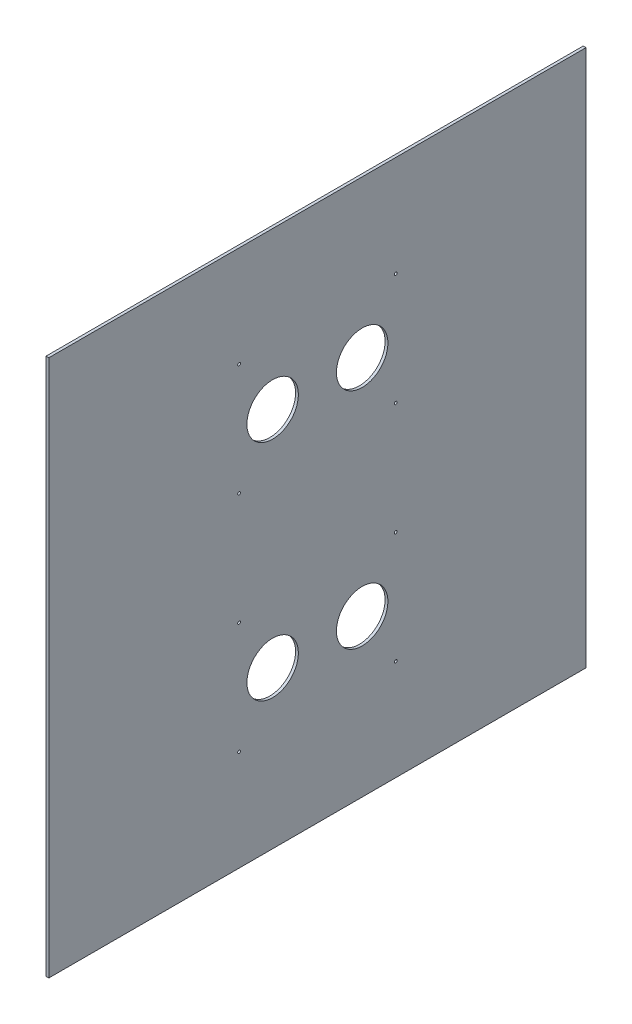
ISO-10303-21;
HEADER;
FILE_DESCRIPTION(('STEP AP214'),'2;1');
FILE_NAME('part.step','',(''),(''),'','','');
FILE_SCHEMA(('AUTOMOTIVE_DESIGN { 1 0 10303 214 1 1 1 1 }'));
ENDSEC;
DATA;
#1=APPLICATION_CONTEXT('core data for automotive mechanical design processes');
#2=APPLICATION_PROTOCOL_DEFINITION('international standard','automotive_design',2000,#1);
#3=PRODUCT_CONTEXT('',#1,'mechanical');
#4=PRODUCT('Part','Part','',(#3));
#5=PRODUCT_RELATED_PRODUCT_CATEGORY('part','',(#4));
#6=PRODUCT_DEFINITION_FORMATION('','',#4);
#7=PRODUCT_DEFINITION_CONTEXT('part definition',#1,'design');
#8=PRODUCT_DEFINITION('design','',#6,#7);
#9=PRODUCT_DEFINITION_SHAPE('','',#8);
#10=(LENGTH_UNIT() NAMED_UNIT(*) SI_UNIT(.MILLI.,.METRE.));
#11=(NAMED_UNIT(*) PLANE_ANGLE_UNIT() SI_UNIT($,.RADIAN.));
#12=(NAMED_UNIT(*) SI_UNIT($,.STERADIAN.) SOLID_ANGLE_UNIT());
#13=UNCERTAINTY_MEASURE_WITH_UNIT(LENGTH_MEASURE(1.E-05),#10,'distance_accuracy_value','');
#14=(GEOMETRIC_REPRESENTATION_CONTEXT(3) GLOBAL_UNCERTAINTY_ASSIGNED_CONTEXT((#13)) GLOBAL_UNIT_ASSIGNED_CONTEXT((#10,
#11,#12)) REPRESENTATION_CONTEXT('',''));
#15=CARTESIAN_POINT('',(0.,0.,0.));
#16=DIRECTION('',(0.,0.,1.));
#17=DIRECTION('',(1.,0.,0.));
#18=AXIS2_PLACEMENT_3D('',#15,#16,#17);
#19=CARTESIAN_POINT('',(3.175,-304.8,304.8));
#20=DIRECTION('',(0.,0.,-1.));
#21=DIRECTION('',(-1.,0.,0.));
#22=AXIS2_PLACEMENT_3D('',#19,#20,#21);
#23=PLANE('',#22);
#24=DIRECTION('',(0.,-1.,0.));
#25=VECTOR('',#24,1.);
#26=CARTESIAN_POINT('',(0.,-304.8,304.8));
#27=LINE('',#26,#25);
#28=CARTESIAN_POINT('',(0.,304.8,304.8));
#29=VERTEX_POINT('',#28);
#30=CARTESIAN_POINT('',(0.,-304.8,304.8));
#31=VERTEX_POINT('',#30);
#32=EDGE_CURVE('E100',#29,#31,#27,.T.);
#33=ORIENTED_EDGE('',*,*,#32,.T.);
#34=DIRECTION('',(-1.,0.,0.));
#35=VECTOR('',#34,1.);
#36=CARTESIAN_POINT('',(3.175,-304.8,304.8));
#37=LINE('',#36,#35);
#38=CARTESIAN_POINT('',(3.175,-304.8,304.8));
#39=VERTEX_POINT('',#38);
#40=EDGE_CURVE('E11',#39,#31,#37,.T.);
#41=ORIENTED_EDGE('',*,*,#40,.F.);
#42=DIRECTION('',(0.,-1.,0.));
#43=VECTOR('',#42,1.);
#44=CARTESIAN_POINT('',(3.175,-304.8,304.8));
#45=LINE('',#44,#43);
#46=CARTESIAN_POINT('',(3.175,304.8,304.8));
#47=VERTEX_POINT('',#46);
#48=EDGE_CURVE('E88',#47,#39,#45,.T.);
#49=ORIENTED_EDGE('',*,*,#48,.F.);
#50=DIRECTION('',(-1.,0.,0.));
#51=VECTOR('',#50,1.);
#52=CARTESIAN_POINT('',(3.175,304.8,304.8));
#53=LINE('',#52,#51);
#54=EDGE_CURVE('E96',#47,#29,#53,.T.);
#55=ORIENTED_EDGE('',*,*,#54,.T.);
#56=EDGE_LOOP('',(#33,#41,#49,#55));
#57=FACE_BOUND('',#56,.T.);
#58=ADVANCED_FACE('F37',(#57),#23,.F.);
#59=CARTESIAN_POINT('',(3.175,-304.8,-304.8));
#60=DIRECTION('',(0.,1.,0.));
#61=DIRECTION('',(0.,0.,1.));
#62=AXIS2_PLACEMENT_3D('',#59,#60,#61);
#63=PLANE('',#62);
#64=DIRECTION('',(0.,0.,-1.));
#65=VECTOR('',#64,1.);
#66=CARTESIAN_POINT('',(0.,-304.8,-304.8));
#67=LINE('',#66,#65);
#68=CARTESIAN_POINT('',(0.,-304.8,-304.8));
#69=VERTEX_POINT('',#68);
#70=EDGE_CURVE('E92',#31,#69,#67,.T.);
#71=ORIENTED_EDGE('',*,*,#70,.T.);
#72=DIRECTION('',(-1.,0.,0.));
#73=VECTOR('',#72,1.);
#74=CARTESIAN_POINT('',(3.175,-304.8,-304.8));
#75=LINE('',#74,#73);
#76=CARTESIAN_POINT('',(3.175,-304.8,-304.8));
#77=VERTEX_POINT('',#76);
#78=EDGE_CURVE('E45',#77,#69,#75,.T.);
#79=ORIENTED_EDGE('',*,*,#78,.F.);
#80=DIRECTION('',(0.,0.,-1.));
#81=VECTOR('',#80,1.);
#82=CARTESIAN_POINT('',(3.175,-304.8,-304.8));
#83=LINE('',#82,#81);
#84=EDGE_CURVE('E83',#39,#77,#83,.T.);
#85=ORIENTED_EDGE('',*,*,#84,.F.);
#86=ORIENTED_EDGE('',*,*,#40,.T.);
#87=EDGE_LOOP('',(#71,#79,#85,#86));
#88=FACE_BOUND('',#87,.T.);
#89=ADVANCED_FACE('F91',(#88),#63,.F.);
#90=CARTESIAN_POINT('',(3.175,-304.8,-304.8));
#91=DIRECTION('',(0.,0.,1.));
#92=DIRECTION('',(1.,0.,0.));
#93=AXIS2_PLACEMENT_3D('',#90,#91,#92);
#94=PLANE('',#93);
#95=DIRECTION('',(0.,1.,0.));
#96=VECTOR('',#95,1.);
#97=CARTESIAN_POINT('',(0.,-304.8,-304.8));
#98=LINE('',#97,#96);
#99=CARTESIAN_POINT('',(0.,304.8,-304.8));
#100=VERTEX_POINT('',#99);
#101=EDGE_CURVE('E70',#69,#100,#98,.T.);
#102=ORIENTED_EDGE('',*,*,#101,.T.);
#103=DIRECTION('',(-1.,0.,0.));
#104=VECTOR('',#103,1.);
#105=CARTESIAN_POINT('',(3.175,304.8,-304.8));
#106=LINE('',#105,#104);
#107=CARTESIAN_POINT('',(3.175,304.8,-304.8));
#108=VERTEX_POINT('',#107);
#109=EDGE_CURVE('E93',#108,#100,#106,.T.);
#110=ORIENTED_EDGE('',*,*,#109,.F.);
#111=DIRECTION('',(0.,1.,0.));
#112=VECTOR('',#111,1.);
#113=CARTESIAN_POINT('',(3.175,-304.8,-304.8));
#114=LINE('',#113,#112);
#115=EDGE_CURVE('E86',#77,#108,#114,.T.);
#116=ORIENTED_EDGE('',*,*,#115,.F.);
#117=ORIENTED_EDGE('',*,*,#78,.T.);
#118=EDGE_LOOP('',(#102,#110,#116,#117));
#119=FACE_BOUND('',#118,.T.);
#120=ADVANCED_FACE('F94',(#119),#94,.F.);
#121=CARTESIAN_POINT('',(3.175,304.8,-304.8));
#122=DIRECTION('',(0.,-1.,0.));
#123=DIRECTION('',(0.,0.,-1.));
#124=AXIS2_PLACEMENT_3D('',#121,#122,#123);
#125=PLANE('',#124);
#126=DIRECTION('',(0.,0.,1.));
#127=VECTOR('',#126,1.);
#128=CARTESIAN_POINT('',(0.,304.8,-304.8));
#129=LINE('',#128,#127);
#130=EDGE_CURVE('E76',#100,#29,#129,.T.);
#131=ORIENTED_EDGE('',*,*,#130,.T.);
#132=ORIENTED_EDGE('',*,*,#54,.F.);
#133=DIRECTION('',(0.,0.,1.));
#134=VECTOR('',#133,1.);
#135=CARTESIAN_POINT('',(3.175,304.8,-304.8));
#136=LINE('',#135,#134);
#137=EDGE_CURVE('E53',#108,#47,#136,.T.);
#138=ORIENTED_EDGE('',*,*,#137,.F.);
#139=ORIENTED_EDGE('',*,*,#109,.T.);
#140=EDGE_LOOP('',(#131,#132,#138,#139));
#141=FACE_BOUND('',#140,.T.);
#142=ADVANCED_FACE('F108',(#141),#125,.F.);
#143=CARTESIAN_POINT('',(3.175,0.,0.));
#144=DIRECTION('',(1.,0.,0.));
#145=DIRECTION('',(0.,0.,-1.));
#146=AXIS2_PLACEMENT_3D('',#143,#144,#145);
#147=PLANE('',#146);
#148=CARTESIAN_POINT('',(3.175,63.4999999999999,-88.9));
#149=DIRECTION('',(-1.,0.,0.));
#150=DIRECTION('',(0.,0.,-1.));
#151=AXIS2_PLACEMENT_3D('',#148,#149,#150);
#152=CIRCLE('',#151,1.58749999999994);
#153=CARTESIAN_POINT('',(3.175,63.4999999999999,-90.4874999999999));
#154=VERTEX_POINT('',#153);
#155=EDGE_CURVE('E175',#154,#154,#152,.T.);
#156=ORIENTED_EDGE('',*,*,#155,.T.);
#157=EDGE_LOOP('',(#156));
#158=FACE_BOUND('',#157,.T.);
#159=CARTESIAN_POINT('',(3.175,190.5,88.9));
#160=DIRECTION('',(-1.,0.,0.));
#161=DIRECTION('',(0.,0.,-1.));
#162=AXIS2_PLACEMENT_3D('',#159,#160,#161);
#163=CIRCLE('',#162,1.58750000000005);
#164=CARTESIAN_POINT('',(3.175,190.5,87.3124999999999));
#165=VERTEX_POINT('',#164);
#166=EDGE_CURVE('E168',#165,#165,#163,.T.);
#167=ORIENTED_EDGE('',*,*,#166,.T.);
#168=EDGE_LOOP('',(#167));
#169=FACE_BOUND('',#168,.T.);
#170=CARTESIAN_POINT('',(3.175,190.5,-88.9));
#171=DIRECTION('',(-1.,0.,0.));
#172=DIRECTION('',(0.,0.,-1.));
#173=AXIS2_PLACEMENT_3D('',#170,#171,#172);
#174=CIRCLE('',#173,1.58750000000005);
#175=CARTESIAN_POINT('',(3.175,190.5,-90.4875000000001));
#176=VERTEX_POINT('',#175);
#177=EDGE_CURVE('E180',#176,#176,#174,.T.);
#178=ORIENTED_EDGE('',*,*,#177,.T.);
#179=EDGE_LOOP('',(#178));
#180=FACE_BOUND('',#179,.T.);
#181=CARTESIAN_POINT('',(3.175,63.4999999999999,88.9));
#182=DIRECTION('',(-1.,0.,0.));
#183=DIRECTION('',(0.,0.,-1.));
#184=AXIS2_PLACEMENT_3D('',#181,#182,#183);
#185=CIRCLE('',#184,1.58750000000004);
#186=CARTESIAN_POINT('',(3.175,63.4999999999999,87.3125));
#187=VERTEX_POINT('',#186);
#188=EDGE_CURVE('E162',#187,#187,#185,.T.);
#189=ORIENTED_EDGE('',*,*,#188,.T.);
#190=EDGE_LOOP('',(#189));
#191=FACE_BOUND('',#190,.T.);
#192=CARTESIAN_POINT('',(3.175,127.,50.8));
#193=DIRECTION('',(-1.,0.,0.));
#194=DIRECTION('',(0.,0.,-1.));
#195=AXIS2_PLACEMENT_3D('',#192,#193,#194);
#196=CIRCLE('',#195,29.21);
#197=CARTESIAN_POINT('',(3.175,127.,21.59));
#198=VERTEX_POINT('',#197);
#199=EDGE_CURVE('E157',#198,#198,#196,.T.);
#200=ORIENTED_EDGE('',*,*,#199,.T.);
#201=EDGE_LOOP('',(#200));
#202=FACE_BOUND('',#201,.T.);
#203=CARTESIAN_POINT('',(3.175,127.,-50.8));
#204=DIRECTION('',(-1.,0.,0.));
#205=DIRECTION('',(0.,0.,-1.));
#206=AXIS2_PLACEMENT_3D('',#203,#204,#205);
#207=CIRCLE('',#206,29.21);
#208=CARTESIAN_POINT('',(3.175,127.,-80.01));
#209=VERTEX_POINT('',#208);
#210=EDGE_CURVE('E150',#209,#209,#207,.T.);
#211=ORIENTED_EDGE('',*,*,#210,.T.);
#212=EDGE_LOOP('',(#211));
#213=FACE_BOUND('',#212,.T.);
#214=CARTESIAN_POINT('',(3.175,-63.4999999999999,-88.9));
#215=DIRECTION('',(1.,0.,0.));
#216=DIRECTION('',(0.,0.,-1.));
#217=AXIS2_PLACEMENT_3D('',#214,#215,#216);
#218=CIRCLE('',#217,1.58749999999994);
#219=CARTESIAN_POINT('',(3.175,-63.4999999999999,-90.4874999999999));
#220=VERTEX_POINT('',#219);
#221=EDGE_CURVE('E139',#220,#220,#218,.T.);
#222=ORIENTED_EDGE('',*,*,#221,.F.);
#223=EDGE_LOOP('',(#222));
#224=FACE_BOUND('',#223,.T.);
#225=CARTESIAN_POINT('',(3.175,-190.5,88.9));
#226=DIRECTION('',(1.,0.,0.));
#227=DIRECTION('',(0.,0.,-1.));
#228=AXIS2_PLACEMENT_3D('',#225,#226,#227);
#229=CIRCLE('',#228,1.58750000000005);
#230=CARTESIAN_POINT('',(3.175,-190.5,87.3124999999999));
#231=VERTEX_POINT('',#230);
#232=EDGE_CURVE('E132',#231,#231,#229,.T.);
#233=ORIENTED_EDGE('',*,*,#232,.F.);
#234=EDGE_LOOP('',(#233));
#235=FACE_BOUND('',#234,.T.);
#236=CARTESIAN_POINT('',(3.175,-190.5,-88.9));
#237=DIRECTION('',(1.,0.,0.));
#238=DIRECTION('',(0.,0.,-1.));
#239=AXIS2_PLACEMENT_3D('',#236,#237,#238);
#240=CIRCLE('',#239,1.58750000000005);
#241=CARTESIAN_POINT('',(3.175,-190.5,-90.4875000000001));
#242=VERTEX_POINT('',#241);
#243=EDGE_CURVE('E144',#242,#242,#240,.T.);
#244=ORIENTED_EDGE('',*,*,#243,.F.);
#245=EDGE_LOOP('',(#244));
#246=FACE_BOUND('',#245,.T.);
#247=CARTESIAN_POINT('',(3.175,-63.4999999999999,88.9));
#248=DIRECTION('',(1.,0.,0.));
#249=DIRECTION('',(0.,0.,-1.));
#250=AXIS2_PLACEMENT_3D('',#247,#248,#249);
#251=CIRCLE('',#250,1.58750000000004);
#252=CARTESIAN_POINT('',(3.175,-63.4999999999999,87.3125));
#253=VERTEX_POINT('',#252);
#254=EDGE_CURVE('E126',#253,#253,#251,.T.);
#255=ORIENTED_EDGE('',*,*,#254,.F.);
#256=EDGE_LOOP('',(#255));
#257=FACE_BOUND('',#256,.T.);
#258=CARTESIAN_POINT('',(3.175,-127.,50.8));
#259=DIRECTION('',(1.,0.,0.));
#260=DIRECTION('',(0.,0.,-1.));
#261=AXIS2_PLACEMENT_3D('',#258,#259,#260);
#262=CIRCLE('',#261,29.21);
#263=CARTESIAN_POINT('',(3.175,-127.,21.59));
#264=VERTEX_POINT('',#263);
#265=EDGE_CURVE('E121',#264,#264,#262,.T.);
#266=ORIENTED_EDGE('',*,*,#265,.F.);
#267=EDGE_LOOP('',(#266));
#268=FACE_BOUND('',#267,.T.);
#269=CARTESIAN_POINT('',(3.175,-127.,-50.8));
#270=DIRECTION('',(1.,0.,0.));
#271=DIRECTION('',(0.,0.,-1.));
#272=AXIS2_PLACEMENT_3D('',#269,#270,#271);
#273=CIRCLE('',#272,29.21);
#274=CARTESIAN_POINT('',(3.175,-127.,-80.01));
#275=VERTEX_POINT('',#274);
#276=EDGE_CURVE('E114',#275,#275,#273,.T.);
#277=ORIENTED_EDGE('',*,*,#276,.F.);
#278=EDGE_LOOP('',(#277));
#279=FACE_BOUND('',#278,.T.);
#280=ORIENTED_EDGE('',*,*,#48,.T.);
#281=ORIENTED_EDGE('',*,*,#84,.T.);
#282=ORIENTED_EDGE('',*,*,#115,.T.);
#283=ORIENTED_EDGE('',*,*,#137,.T.);
#284=EDGE_LOOP('',(#280,#281,#282,#283));
#285=FACE_BOUND('',#284,.T.);
#286=ADVANCED_FACE('F84',(#158,#169,#180,#191,#202,#213,#224,#235,#246,#257,#268,#279,#285),
#147,.T.);
#287=CARTESIAN_POINT('',(0.,0.,0.));
#288=DIRECTION('',(1.,0.,0.));
#289=DIRECTION('',(0.,0.,-1.));
#290=AXIS2_PLACEMENT_3D('',#287,#288,#289);
#291=PLANE('',#290);
#292=CARTESIAN_POINT('',(0.,63.4999999999999,-88.9));
#293=DIRECTION('',(-1.,0.,0.));
#294=DIRECTION('',(0.,0.,-1.));
#295=AXIS2_PLACEMENT_3D('',#292,#293,#294);
#296=CIRCLE('',#295,1.58749999999994);
#297=CARTESIAN_POINT('',(0.,63.4999999999999,-90.4874999999999));
#298=VERTEX_POINT('',#297);
#299=EDGE_CURVE('E165',#298,#298,#296,.T.);
#300=ORIENTED_EDGE('',*,*,#299,.F.);
#301=EDGE_LOOP('',(#300));
#302=FACE_BOUND('',#301,.T.);
#303=CARTESIAN_POINT('',(0.,190.5,88.9));
#304=DIRECTION('',(-1.,0.,0.));
#305=DIRECTION('',(0.,0.,-1.));
#306=AXIS2_PLACEMENT_3D('',#303,#304,#305);
#307=CIRCLE('',#306,1.58750000000005);
#308=CARTESIAN_POINT('',(0.,190.5,87.3124999999999));
#309=VERTEX_POINT('',#308);
#310=EDGE_CURVE('E171',#309,#309,#307,.T.);
#311=ORIENTED_EDGE('',*,*,#310,.F.);
#312=EDGE_LOOP('',(#311));
#313=FACE_BOUND('',#312,.T.);
#314=CARTESIAN_POINT('',(0.,190.5,-88.9));
#315=DIRECTION('',(-1.,0.,0.));
#316=DIRECTION('',(0.,0.,-1.));
#317=AXIS2_PLACEMENT_3D('',#314,#315,#316);
#318=CIRCLE('',#317,1.58750000000005);
#319=CARTESIAN_POINT('',(0.,190.5,-90.4875000000001));
#320=VERTEX_POINT('',#319);
#321=EDGE_CURVE('E172',#320,#320,#318,.T.);
#322=ORIENTED_EDGE('',*,*,#321,.F.);
#323=EDGE_LOOP('',(#322));
#324=FACE_BOUND('',#323,.T.);
#325=CARTESIAN_POINT('',(0.,63.4999999999999,88.9));
#326=DIRECTION('',(-1.,0.,0.));
#327=DIRECTION('',(0.,0.,-1.));
#328=AXIS2_PLACEMENT_3D('',#325,#326,#327);
#329=CIRCLE('',#328,1.58750000000004);
#330=CARTESIAN_POINT('',(0.,63.4999999999999,87.3125));
#331=VERTEX_POINT('',#330);
#332=EDGE_CURVE('E154',#331,#331,#329,.T.);
#333=ORIENTED_EDGE('',*,*,#332,.F.);
#334=EDGE_LOOP('',(#333));
#335=FACE_BOUND('',#334,.T.);
#336=CARTESIAN_POINT('',(0.,127.,50.8));
#337=DIRECTION('',(-1.,0.,0.));
#338=DIRECTION('',(0.,0.,-1.));
#339=AXIS2_PLACEMENT_3D('',#336,#337,#338);
#340=CIRCLE('',#339,29.21);
#341=CARTESIAN_POINT('',(0.,127.,21.59));
#342=VERTEX_POINT('',#341);
#343=EDGE_CURVE('E147',#342,#342,#340,.T.);
#344=ORIENTED_EDGE('',*,*,#343,.F.);
#345=EDGE_LOOP('',(#344));
#346=FACE_BOUND('',#345,.T.);
#347=CARTESIAN_POINT('',(0.,127.,-50.8));
#348=DIRECTION('',(-1.,0.,0.));
#349=DIRECTION('',(0.,0.,-1.));
#350=AXIS2_PLACEMENT_3D('',#347,#348,#349);
#351=CIRCLE('',#350,29.21);
#352=CARTESIAN_POINT('',(0.,127.,-80.01));
#353=VERTEX_POINT('',#352);
#354=EDGE_CURVE('E153',#353,#353,#351,.T.);
#355=ORIENTED_EDGE('',*,*,#354,.F.);
#356=EDGE_LOOP('',(#355));
#357=FACE_BOUND('',#356,.T.);
#358=CARTESIAN_POINT('',(0.,-63.4999999999999,-88.9));
#359=DIRECTION('',(1.,0.,0.));
#360=DIRECTION('',(0.,0.,-1.));
#361=AXIS2_PLACEMENT_3D('',#358,#359,#360);
#362=CIRCLE('',#361,1.58749999999994);
#363=CARTESIAN_POINT('',(0.,-63.4999999999999,-90.4874999999999));
#364=VERTEX_POINT('',#363);
#365=EDGE_CURVE('E129',#364,#364,#362,.T.);
#366=ORIENTED_EDGE('',*,*,#365,.T.);
#367=EDGE_LOOP('',(#366));
#368=FACE_BOUND('',#367,.T.);
#369=CARTESIAN_POINT('',(0.,-190.5,88.9));
#370=DIRECTION('',(1.,0.,0.));
#371=DIRECTION('',(0.,0.,-1.));
#372=AXIS2_PLACEMENT_3D('',#369,#370,#371);
#373=CIRCLE('',#372,1.58750000000005);
#374=CARTESIAN_POINT('',(0.,-190.5,87.3124999999999));
#375=VERTEX_POINT('',#374);
#376=EDGE_CURVE('E135',#375,#375,#373,.T.);
#377=ORIENTED_EDGE('',*,*,#376,.T.);
#378=EDGE_LOOP('',(#377));
#379=FACE_BOUND('',#378,.T.);
#380=CARTESIAN_POINT('',(0.,-190.5,-88.9));
#381=DIRECTION('',(1.,0.,0.));
#382=DIRECTION('',(0.,0.,-1.));
#383=AXIS2_PLACEMENT_3D('',#380,#381,#382);
#384=CIRCLE('',#383,1.58750000000005);
#385=CARTESIAN_POINT('',(0.,-190.5,-90.4875000000001));
#386=VERTEX_POINT('',#385);
#387=EDGE_CURVE('E136',#386,#386,#384,.T.);
#388=ORIENTED_EDGE('',*,*,#387,.T.);
#389=EDGE_LOOP('',(#388));
#390=FACE_BOUND('',#389,.T.);
#391=CARTESIAN_POINT('',(0.,-63.4999999999999,88.9));
#392=DIRECTION('',(1.,0.,0.));
#393=DIRECTION('',(0.,0.,-1.));
#394=AXIS2_PLACEMENT_3D('',#391,#392,#393);
#395=CIRCLE('',#394,1.58750000000004);
#396=CARTESIAN_POINT('',(0.,-63.4999999999999,87.3125));
#397=VERTEX_POINT('',#396);
#398=EDGE_CURVE('E118',#397,#397,#395,.T.);
#399=ORIENTED_EDGE('',*,*,#398,.T.);
#400=EDGE_LOOP('',(#399));
#401=FACE_BOUND('',#400,.T.);
#402=CARTESIAN_POINT('',(0.,-127.,50.8));
#403=DIRECTION('',(1.,0.,0.));
#404=DIRECTION('',(0.,0.,-1.));
#405=AXIS2_PLACEMENT_3D('',#402,#403,#404);
#406=CIRCLE('',#405,29.21);
#407=CARTESIAN_POINT('',(0.,-127.,21.59));
#408=VERTEX_POINT('',#407);
#409=EDGE_CURVE('E103',#408,#408,#406,.T.);
#410=ORIENTED_EDGE('',*,*,#409,.T.);
#411=EDGE_LOOP('',(#410));
#412=FACE_BOUND('',#411,.T.);
#413=CARTESIAN_POINT('',(0.,-127.,-50.8));
#414=DIRECTION('',(1.,0.,0.));
#415=DIRECTION('',(0.,0.,-1.));
#416=AXIS2_PLACEMENT_3D('',#413,#414,#415);
#417=CIRCLE('',#416,29.21);
#418=CARTESIAN_POINT('',(0.,-127.,-80.01));
#419=VERTEX_POINT('',#418);
#420=EDGE_CURVE('E117',#419,#419,#417,.T.);
#421=ORIENTED_EDGE('',*,*,#420,.T.);
#422=EDGE_LOOP('',(#421));
#423=FACE_BOUND('',#422,.T.);
#424=ORIENTED_EDGE('',*,*,#32,.F.);
#425=ORIENTED_EDGE('',*,*,#130,.F.);
#426=ORIENTED_EDGE('',*,*,#101,.F.);
#427=ORIENTED_EDGE('',*,*,#70,.F.);
#428=EDGE_LOOP('',(#424,#425,#426,#427));
#429=FACE_BOUND('',#428,.T.);
#430=ADVANCED_FACE('F111',(#302,#313,#324,#335,#346,#357,#368,#379,#390,#401,#412,#423,#429),
#291,.F.);
#431=CARTESIAN_POINT('',(0.,-127.,-50.8));
#432=DIRECTION('',(1.,0.,0.));
#433=DIRECTION('',(0.,0.,-1.));
#434=AXIS2_PLACEMENT_3D('',#431,#432,#433);
#435=CYLINDRICAL_SURFACE('',#434,29.21);
#436=ORIENTED_EDGE('',*,*,#420,.F.);
#437=EDGE_LOOP('',(#436));
#438=FACE_BOUND('',#437,.T.);
#439=ORIENTED_EDGE('',*,*,#276,.T.);
#440=EDGE_LOOP('',(#439));
#441=FACE_BOUND('',#440,.T.);
#442=ADVANCED_FACE('F191',(#438,#441),#435,.F.);
#443=CARTESIAN_POINT('',(0.,-127.,50.8));
#444=DIRECTION('',(1.,0.,0.));
#445=DIRECTION('',(0.,0.,-1.));
#446=AXIS2_PLACEMENT_3D('',#443,#444,#445);
#447=CYLINDRICAL_SURFACE('',#446,29.21);
#448=ORIENTED_EDGE('',*,*,#409,.F.);
#449=EDGE_LOOP('',(#448));
#450=FACE_BOUND('',#449,.T.);
#451=ORIENTED_EDGE('',*,*,#265,.T.);
#452=EDGE_LOOP('',(#451));
#453=FACE_BOUND('',#452,.T.);
#454=ADVANCED_FACE('F214',(#450,#453),#447,.F.);
#455=CARTESIAN_POINT('',(0.,-63.4999999999999,88.9));
#456=DIRECTION('',(1.,0.,0.));
#457=DIRECTION('',(0.,0.,-1.));
#458=AXIS2_PLACEMENT_3D('',#455,#456,#457);
#459=CYLINDRICAL_SURFACE('',#458,1.58750000000004);
#460=ORIENTED_EDGE('',*,*,#398,.F.);
#461=EDGE_LOOP('',(#460));
#462=FACE_BOUND('',#461,.T.);
#463=ORIENTED_EDGE('',*,*,#254,.T.);
#464=EDGE_LOOP('',(#463));
#465=FACE_BOUND('',#464,.T.);
#466=ADVANCED_FACE('F257',(#462,#465),#459,.F.);
#467=CARTESIAN_POINT('',(0.,-190.5,-88.9));
#468=DIRECTION('',(1.,0.,0.));
#469=DIRECTION('',(0.,0.,-1.));
#470=AXIS2_PLACEMENT_3D('',#467,#468,#469);
#471=CYLINDRICAL_SURFACE('',#470,1.58750000000005);
#472=ORIENTED_EDGE('',*,*,#387,.F.);
#473=EDGE_LOOP('',(#472));
#474=FACE_BOUND('',#473,.T.);
#475=ORIENTED_EDGE('',*,*,#243,.T.);
#476=EDGE_LOOP('',(#475));
#477=FACE_BOUND('',#476,.T.);
#478=ADVANCED_FACE('F267',(#474,#477),#471,.F.);
#479=CARTESIAN_POINT('',(0.,-190.5,88.9));
#480=DIRECTION('',(1.,0.,0.));
#481=DIRECTION('',(0.,0.,-1.));
#482=AXIS2_PLACEMENT_3D('',#479,#480,#481);
#483=CYLINDRICAL_SURFACE('',#482,1.58750000000005);
#484=ORIENTED_EDGE('',*,*,#376,.F.);
#485=EDGE_LOOP('',(#484));
#486=FACE_BOUND('',#485,.T.);
#487=ORIENTED_EDGE('',*,*,#232,.T.);
#488=EDGE_LOOP('',(#487));
#489=FACE_BOUND('',#488,.T.);
#490=ADVANCED_FACE('F277',(#486,#489),#483,.F.);
#491=CARTESIAN_POINT('',(0.,-63.4999999999999,-88.9));
#492=DIRECTION('',(1.,0.,0.));
#493=DIRECTION('',(0.,0.,-1.));
#494=AXIS2_PLACEMENT_3D('',#491,#492,#493);
#495=CYLINDRICAL_SURFACE('',#494,1.58749999999994);
#496=ORIENTED_EDGE('',*,*,#365,.F.);
#497=EDGE_LOOP('',(#496));
#498=FACE_BOUND('',#497,.T.);
#499=ORIENTED_EDGE('',*,*,#221,.T.);
#500=EDGE_LOOP('',(#499));
#501=FACE_BOUND('',#500,.T.);
#502=ADVANCED_FACE('F287',(#498,#501),#495,.F.);
#503=CARTESIAN_POINT('',(0.,127.,-50.8));
#504=DIRECTION('',(1.,0.,0.));
#505=DIRECTION('',(0.,0.,-1.));
#506=AXIS2_PLACEMENT_3D('',#503,#504,#505);
#507=CYLINDRICAL_SURFACE('',#506,29.21);
#508=ORIENTED_EDGE('',*,*,#354,.T.);
#509=EDGE_LOOP('',(#508));
#510=FACE_BOUND('',#509,.T.);
#511=ORIENTED_EDGE('',*,*,#210,.F.);
#512=EDGE_LOOP('',(#511));
#513=FACE_BOUND('',#512,.T.);
#514=ADVANCED_FACE('F296',(#510,#513),#507,.F.);
#515=CARTESIAN_POINT('',(0.,127.,50.8));
#516=DIRECTION('',(1.,0.,0.));
#517=DIRECTION('',(0.,0.,-1.));
#518=AXIS2_PLACEMENT_3D('',#515,#516,#517);
#519=CYLINDRICAL_SURFACE('',#518,29.21);
#520=ORIENTED_EDGE('',*,*,#343,.T.);
#521=EDGE_LOOP('',(#520));
#522=FACE_BOUND('',#521,.T.);
#523=ORIENTED_EDGE('',*,*,#199,.F.);
#524=EDGE_LOOP('',(#523));
#525=FACE_BOUND('',#524,.T.);
#526=ADVANCED_FACE('F315',(#522,#525),#519,.F.);
#527=CARTESIAN_POINT('',(0.,63.4999999999999,88.9));
#528=DIRECTION('',(1.,0.,0.));
#529=DIRECTION('',(0.,0.,-1.));
#530=AXIS2_PLACEMENT_3D('',#527,#528,#529);
#531=CYLINDRICAL_SURFACE('',#530,1.58750000000004);
#532=ORIENTED_EDGE('',*,*,#332,.T.);
#533=EDGE_LOOP('',(#532));
#534=FACE_BOUND('',#533,.T.);
#535=ORIENTED_EDGE('',*,*,#188,.F.);
#536=EDGE_LOOP('',(#535));
#537=FACE_BOUND('',#536,.T.);
#538=ADVANCED_FACE('F325',(#534,#537),#531,.F.);
#539=CARTESIAN_POINT('',(0.,190.5,-88.9));
#540=DIRECTION('',(1.,0.,0.));
#541=DIRECTION('',(0.,0.,-1.));
#542=AXIS2_PLACEMENT_3D('',#539,#540,#541);
#543=CYLINDRICAL_SURFACE('',#542,1.58750000000005);
#544=ORIENTED_EDGE('',*,*,#321,.T.);
#545=EDGE_LOOP('',(#544));
#546=FACE_BOUND('',#545,.T.);
#547=ORIENTED_EDGE('',*,*,#177,.F.);
#548=EDGE_LOOP('',(#547));
#549=FACE_BOUND('',#548,.T.);
#550=ADVANCED_FACE('F186',(#546,#549),#543,.F.);
#551=CARTESIAN_POINT('',(0.,190.5,88.9));
#552=DIRECTION('',(1.,0.,0.));
#553=DIRECTION('',(0.,0.,-1.));
#554=AXIS2_PLACEMENT_3D('',#551,#552,#553);
#555=CYLINDRICAL_SURFACE('',#554,1.58750000000005);
#556=ORIENTED_EDGE('',*,*,#310,.T.);
#557=EDGE_LOOP('',(#556));
#558=FACE_BOUND('',#557,.T.);
#559=ORIENTED_EDGE('',*,*,#166,.F.);
#560=EDGE_LOOP('',(#559));
#561=FACE_BOUND('',#560,.T.);
#562=ADVANCED_FACE('F344',(#558,#561),#555,.F.);
#563=CARTESIAN_POINT('',(0.,63.4999999999999,-88.9));
#564=DIRECTION('',(1.,0.,0.));
#565=DIRECTION('',(0.,0.,-1.));
#566=AXIS2_PLACEMENT_3D('',#563,#564,#565);
#567=CYLINDRICAL_SURFACE('',#566,1.58749999999994);
#568=ORIENTED_EDGE('',*,*,#299,.T.);
#569=EDGE_LOOP('',(#568));
#570=FACE_BOUND('',#569,.T.);
#571=ORIENTED_EDGE('',*,*,#155,.F.);
#572=EDGE_LOOP('',(#571));
#573=FACE_BOUND('',#572,.T.);
#574=ADVANCED_FACE('F353',(#570,#573),#567,.F.);
#575=CLOSED_SHELL('',(#58,#89,#120,#142,#286,#430,#442,#454,#466,#478,#490,#502,#514,#526,#538,
#550,#562,#574));
#576=MANIFOLD_SOLID_BREP('B2',#575);
#577=ADVANCED_BREP_SHAPE_REPRESENTATION('',(#18,#576),#14);
#578=SHAPE_DEFINITION_REPRESENTATION(#9,#577);
ENDSEC;
END-ISO-10303-21;
